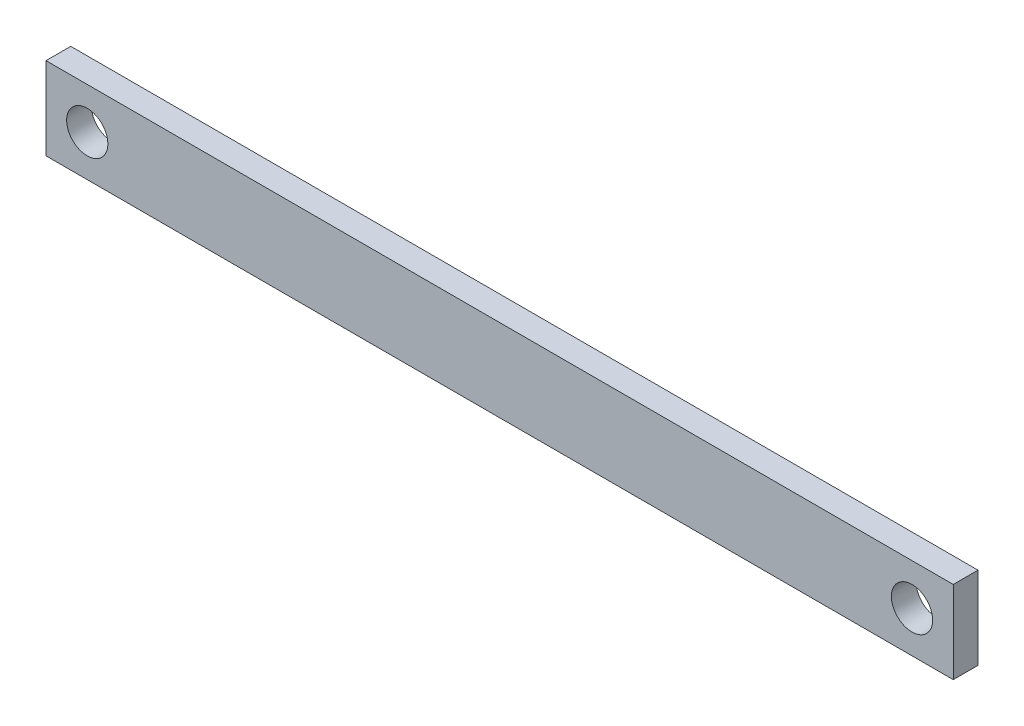
ISO-10303-21;
HEADER;
FILE_DESCRIPTION(('STEP AP214'),'2;1');
FILE_NAME('part.step','',(''),(''),'','','');
FILE_SCHEMA(('AUTOMOTIVE_DESIGN { 1 0 10303 214 1 1 1 1 }'));
ENDSEC;
DATA;
#1=APPLICATION_CONTEXT('core data for automotive mechanical design processes');
#2=APPLICATION_PROTOCOL_DEFINITION('international standard','automotive_design',2000,#1);
#3=PRODUCT_CONTEXT('',#1,'mechanical');
#4=PRODUCT('Part','Part','',(#3));
#5=PRODUCT_RELATED_PRODUCT_CATEGORY('part','',(#4));
#6=PRODUCT_DEFINITION_FORMATION('','',#4);
#7=PRODUCT_DEFINITION_CONTEXT('part definition',#1,'design');
#8=PRODUCT_DEFINITION('design','',#6,#7);
#9=PRODUCT_DEFINITION_SHAPE('','',#8);
#10=(LENGTH_UNIT() NAMED_UNIT(*) SI_UNIT(.MILLI.,.METRE.));
#11=(NAMED_UNIT(*) PLANE_ANGLE_UNIT() SI_UNIT($,.RADIAN.));
#12=(NAMED_UNIT(*) SI_UNIT($,.STERADIAN.) SOLID_ANGLE_UNIT());
#13=UNCERTAINTY_MEASURE_WITH_UNIT(LENGTH_MEASURE(1.E-05),#10,'distance_accuracy_value','');
#14=(GEOMETRIC_REPRESENTATION_CONTEXT(3) GLOBAL_UNCERTAINTY_ASSIGNED_CONTEXT((#13)) GLOBAL_UNIT_ASSIGNED_CONTEXT((#10,
#11,#12)) REPRESENTATION_CONTEXT('',''));
#15=CARTESIAN_POINT('',(0.,0.,0.));
#16=DIRECTION('',(0.,0.,1.));
#17=DIRECTION('',(1.,0.,0.));
#18=AXIS2_PLACEMENT_3D('',#15,#16,#17);
#19=CARTESIAN_POINT('',(0.,0.,3.));
#20=DIRECTION('',(0.,0.,-1.));
#21=DIRECTION('',(-1.,0.,0.));
#22=AXIS2_PLACEMENT_3D('',#19,#20,#21);
#23=PLANE('',#22);
#24=DIRECTION('',(0.,1.,0.));
#25=VECTOR('',#24,1.);
#26=CARTESIAN_POINT('',(55.,-5.,3.));
#27=LINE('',#26,#25);
#28=CARTESIAN_POINT('',(55.,-5.,3.));
#29=VERTEX_POINT('',#28);
#30=CARTESIAN_POINT('',(55.,5.,3.));
#31=VERTEX_POINT('',#30);
#32=EDGE_CURVE('E85',#29,#31,#27,.T.);
#33=ORIENTED_EDGE('',*,*,#32,.T.);
#34=DIRECTION('',(-1.,0.,0.));
#35=VECTOR('',#34,1.);
#36=CARTESIAN_POINT('',(-55.,5.,3.));
#37=LINE('',#36,#35);
#38=CARTESIAN_POINT('',(-55.,5.,3.));
#39=VERTEX_POINT('',#38);
#40=EDGE_CURVE('E80',#31,#39,#37,.T.);
#41=ORIENTED_EDGE('',*,*,#40,.T.);
#42=DIRECTION('',(0.,-1.,0.));
#43=VECTOR('',#42,1.);
#44=CARTESIAN_POINT('',(-55.,-5.,3.));
#45=LINE('',#44,#43);
#46=CARTESIAN_POINT('',(-55.,-5.,3.));
#47=VERTEX_POINT('',#46);
#48=EDGE_CURVE('E83',#39,#47,#45,.T.);
#49=ORIENTED_EDGE('',*,*,#48,.T.);
#50=DIRECTION('',(1.,0.,0.));
#51=VECTOR('',#50,1.);
#52=CARTESIAN_POINT('',(-55.,-5.,3.));
#53=LINE('',#52,#51);
#54=EDGE_CURVE('E50',#47,#29,#53,.T.);
#55=ORIENTED_EDGE('',*,*,#54,.T.);
#56=EDGE_LOOP('',(#33,#41,#49,#55));
#57=FACE_BOUND('',#56,.T.);
#58=CARTESIAN_POINT('',(-50.,0.,3.));
#59=DIRECTION('',(0.,0.,1.));
#60=DIRECTION('',(1.,0.,0.));
#61=AXIS2_PLACEMENT_3D('',#58,#59,#60);
#62=CIRCLE('',#61,2.5);
#63=CARTESIAN_POINT('',(-47.5,0.,3.));
#64=VERTEX_POINT('',#63);
#65=EDGE_CURVE('E100',#64,#64,#62,.T.);
#66=ORIENTED_EDGE('',*,*,#65,.F.);
#67=EDGE_LOOP('',(#66));
#68=FACE_BOUND('',#67,.T.);
#69=CARTESIAN_POINT('',(50.,0.,3.));
#70=DIRECTION('',(0.,0.,1.));
#71=DIRECTION('',(1.,0.,0.));
#72=AXIS2_PLACEMENT_3D('',#69,#70,#71);
#73=CIRCLE('',#72,2.5);
#74=CARTESIAN_POINT('',(52.5,0.,3.));
#75=VERTEX_POINT('',#74);
#76=EDGE_CURVE('E115',#75,#75,#73,.T.);
#77=ORIENTED_EDGE('',*,*,#76,.F.);
#78=EDGE_LOOP('',(#77));
#79=FACE_BOUND('',#78,.T.);
#80=ADVANCED_FACE('F33',(#57,#68,#79),#23,.F.);
#81=CARTESIAN_POINT('',(0.,0.,0.));
#82=DIRECTION('',(0.,0.,-1.));
#83=DIRECTION('',(-1.,0.,0.));
#84=AXIS2_PLACEMENT_3D('',#81,#82,#83);
#85=PLANE('',#84);
#86=CARTESIAN_POINT('',(-50.,0.,0.));
#87=DIRECTION('',(0.,0.,1.));
#88=DIRECTION('',(1.,0.,0.));
#89=AXIS2_PLACEMENT_3D('',#86,#87,#88);
#90=CIRCLE('',#89,2.5);
#91=CARTESIAN_POINT('',(-47.5,0.,0.));
#92=VERTEX_POINT('',#91);
#93=EDGE_CURVE('E112',#92,#92,#90,.T.);
#94=ORIENTED_EDGE('',*,*,#93,.T.);
#95=EDGE_LOOP('',(#94));
#96=FACE_BOUND('',#95,.T.);
#97=DIRECTION('',(0.,1.,0.));
#98=VECTOR('',#97,1.);
#99=CARTESIAN_POINT('',(55.,-5.,0.));
#100=LINE('',#99,#98);
#101=CARTESIAN_POINT('',(55.,-5.,0.));
#102=VERTEX_POINT('',#101);
#103=CARTESIAN_POINT('',(55.,5.,0.));
#104=VERTEX_POINT('',#103);
#105=EDGE_CURVE('E97',#102,#104,#100,.T.);
#106=ORIENTED_EDGE('',*,*,#105,.F.);
#107=DIRECTION('',(1.,0.,0.));
#108=VECTOR('',#107,1.);
#109=CARTESIAN_POINT('',(-55.,-5.,0.));
#110=LINE('',#109,#108);
#111=CARTESIAN_POINT('',(-55.,-5.,0.));
#112=VERTEX_POINT('',#111);
#113=EDGE_CURVE('E73',#112,#102,#110,.T.);
#114=ORIENTED_EDGE('',*,*,#113,.F.);
#115=DIRECTION('',(0.,-1.,0.));
#116=VECTOR('',#115,1.);
#117=CARTESIAN_POINT('',(-55.,-5.,0.));
#118=LINE('',#117,#116);
#119=CARTESIAN_POINT('',(-55.,5.,0.));
#120=VERTEX_POINT('',#119);
#121=EDGE_CURVE('E67',#120,#112,#118,.T.);
#122=ORIENTED_EDGE('',*,*,#121,.F.);
#123=DIRECTION('',(-1.,0.,0.));
#124=VECTOR('',#123,1.);
#125=CARTESIAN_POINT('',(-55.,5.,0.));
#126=LINE('',#125,#124);
#127=EDGE_CURVE('E89',#104,#120,#126,.T.);
#128=ORIENTED_EDGE('',*,*,#127,.F.);
#129=EDGE_LOOP('',(#106,#114,#122,#128));
#130=FACE_BOUND('',#129,.T.);
#131=CARTESIAN_POINT('',(50.,0.,0.));
#132=DIRECTION('',(0.,0.,1.));
#133=DIRECTION('',(1.,0.,0.));
#134=AXIS2_PLACEMENT_3D('',#131,#132,#133);
#135=CIRCLE('',#134,2.5);
#136=CARTESIAN_POINT('',(52.5,0.,0.));
#137=VERTEX_POINT('',#136);
#138=EDGE_CURVE('E118',#137,#137,#135,.T.);
#139=ORIENTED_EDGE('',*,*,#138,.T.);
#140=EDGE_LOOP('',(#139));
#141=FACE_BOUND('',#140,.T.);
#142=ADVANCED_FACE('F108',(#96,#130,#141),#85,.T.);
#143=CARTESIAN_POINT('',(55.,-5.,3.));
#144=DIRECTION('',(-1.,0.,0.));
#145=DIRECTION('',(0.,0.,1.));
#146=AXIS2_PLACEMENT_3D('',#143,#144,#145);
#147=PLANE('',#146);
#148=ORIENTED_EDGE('',*,*,#105,.T.);
#149=DIRECTION('',(0.,0.,-1.));
#150=VECTOR('',#149,1.);
#151=CARTESIAN_POINT('',(55.,5.,3.));
#152=LINE('',#151,#150);
#153=EDGE_CURVE('E11',#31,#104,#152,.T.);
#154=ORIENTED_EDGE('',*,*,#153,.F.);
#155=ORIENTED_EDGE('',*,*,#32,.F.);
#156=DIRECTION('',(0.,0.,-1.));
#157=VECTOR('',#156,1.);
#158=CARTESIAN_POINT('',(55.,-5.,3.));
#159=LINE('',#158,#157);
#160=EDGE_CURVE('E93',#29,#102,#159,.T.);
#161=ORIENTED_EDGE('',*,*,#160,.T.);
#162=EDGE_LOOP('',(#148,#154,#155,#161));
#163=FACE_BOUND('',#162,.T.);
#164=ADVANCED_FACE('F35',(#163),#147,.F.);
#165=CARTESIAN_POINT('',(-55.,5.,3.));
#166=DIRECTION('',(0.,-1.,0.));
#167=DIRECTION('',(0.,0.,-1.));
#168=AXIS2_PLACEMENT_3D('',#165,#166,#167);
#169=PLANE('',#168);
#170=ORIENTED_EDGE('',*,*,#127,.T.);
#171=DIRECTION('',(0.,0.,-1.));
#172=VECTOR('',#171,1.);
#173=CARTESIAN_POINT('',(-55.,5.,3.));
#174=LINE('',#173,#172);
#175=EDGE_CURVE('E42',#39,#120,#174,.T.);
#176=ORIENTED_EDGE('',*,*,#175,.F.);
#177=ORIENTED_EDGE('',*,*,#40,.F.);
#178=ORIENTED_EDGE('',*,*,#153,.T.);
#179=EDGE_LOOP('',(#170,#176,#177,#178));
#180=FACE_BOUND('',#179,.T.);
#181=ADVANCED_FACE('F88',(#180),#169,.F.);
#182=CARTESIAN_POINT('',(-55.,-5.,3.));
#183=DIRECTION('',(1.,0.,0.));
#184=DIRECTION('',(0.,0.,-1.));
#185=AXIS2_PLACEMENT_3D('',#182,#183,#184);
#186=PLANE('',#185);
#187=ORIENTED_EDGE('',*,*,#121,.T.);
#188=DIRECTION('',(0.,0.,-1.));
#189=VECTOR('',#188,1.);
#190=CARTESIAN_POINT('',(-55.,-5.,3.));
#191=LINE('',#190,#189);
#192=EDGE_CURVE('E90',#47,#112,#191,.T.);
#193=ORIENTED_EDGE('',*,*,#192,.F.);
#194=ORIENTED_EDGE('',*,*,#48,.F.);
#195=ORIENTED_EDGE('',*,*,#175,.T.);
#196=EDGE_LOOP('',(#187,#193,#194,#195));
#197=FACE_BOUND('',#196,.T.);
#198=ADVANCED_FACE('F91',(#197),#186,.F.);
#199=CARTESIAN_POINT('',(-55.,-5.,3.));
#200=DIRECTION('',(0.,1.,0.));
#201=DIRECTION('',(0.,0.,1.));
#202=AXIS2_PLACEMENT_3D('',#199,#200,#201);
#203=PLANE('',#202);
#204=ORIENTED_EDGE('',*,*,#113,.T.);
#205=ORIENTED_EDGE('',*,*,#160,.F.);
#206=ORIENTED_EDGE('',*,*,#54,.F.);
#207=ORIENTED_EDGE('',*,*,#192,.T.);
#208=EDGE_LOOP('',(#204,#205,#206,#207));
#209=FACE_BOUND('',#208,.T.);
#210=ADVANCED_FACE('F105',(#209),#203,.F.);
#211=CARTESIAN_POINT('',(-50.,0.,3.));
#212=DIRECTION('',(0.,0.,-1.));
#213=DIRECTION('',(-1.,0.,0.));
#214=AXIS2_PLACEMENT_3D('',#211,#212,#213);
#215=CYLINDRICAL_SURFACE('',#214,2.5);
#216=ORIENTED_EDGE('',*,*,#65,.T.);
#217=EDGE_LOOP('',(#216));
#218=FACE_BOUND('',#217,.T.);
#219=ORIENTED_EDGE('',*,*,#93,.F.);
#220=EDGE_LOOP('',(#219));
#221=FACE_BOUND('',#220,.T.);
#222=ADVANCED_FACE('F135',(#218,#221),#215,.F.);
#223=CARTESIAN_POINT('',(50.,0.,3.));
#224=DIRECTION('',(0.,0.,-1.));
#225=DIRECTION('',(-1.,0.,0.));
#226=AXIS2_PLACEMENT_3D('',#223,#224,#225);
#227=CYLINDRICAL_SURFACE('',#226,2.5);
#228=ORIENTED_EDGE('',*,*,#76,.T.);
#229=EDGE_LOOP('',(#228));
#230=FACE_BOUND('',#229,.T.);
#231=ORIENTED_EDGE('',*,*,#138,.F.);
#232=EDGE_LOOP('',(#231));
#233=FACE_BOUND('',#232,.T.);
#234=ADVANCED_FACE('F124',(#230,#233),#227,.F.);
#235=CLOSED_SHELL('',(#80,#142,#164,#181,#198,#210,#222,#234));
#236=MANIFOLD_SOLID_BREP('B2',#235);
#237=ADVANCED_BREP_SHAPE_REPRESENTATION('',(#18,#236),#14);
#238=SHAPE_DEFINITION_REPRESENTATION(#9,#237);
ENDSEC;
END-ISO-10303-21;
